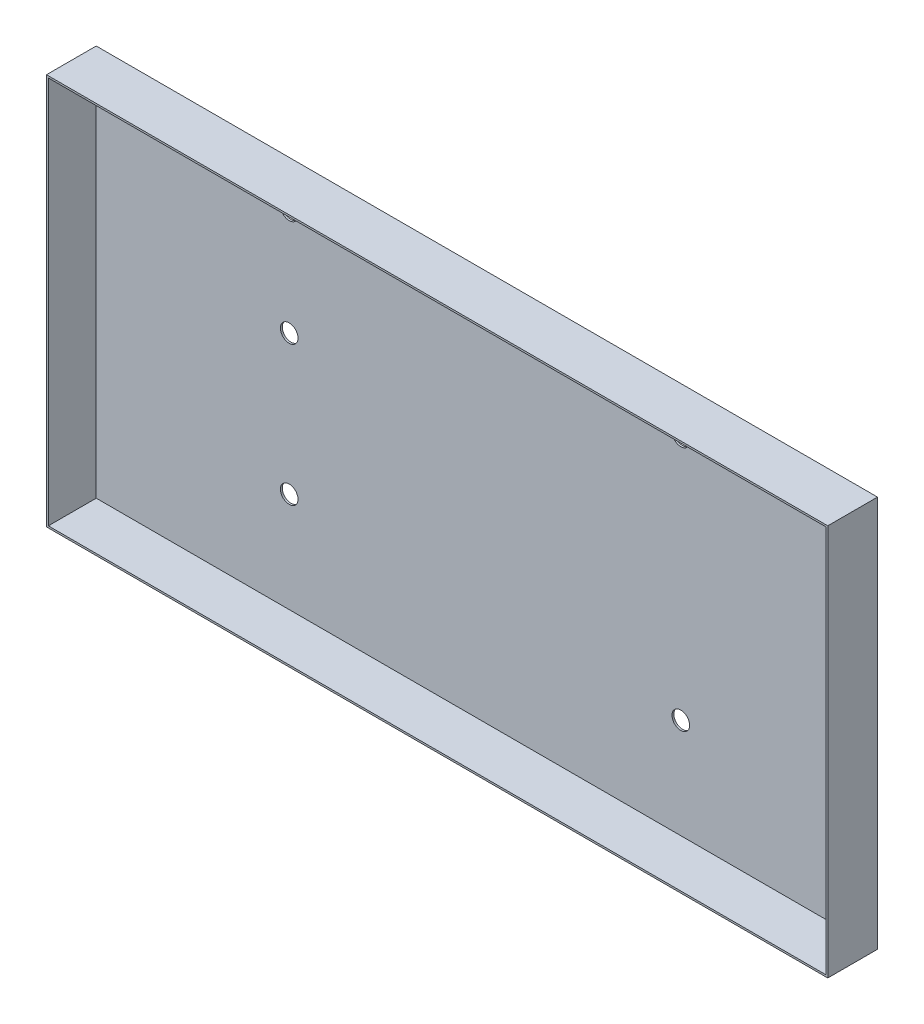
ISO-10303-21;
HEADER;
FILE_DESCRIPTION(('STEP AP214'),'2;1');
FILE_NAME('part.step','',(''),(''),'','','');
FILE_SCHEMA(('AUTOMOTIVE_DESIGN { 1 0 10303 214 1 1 1 1 }'));
ENDSEC;
DATA;
#1=APPLICATION_CONTEXT('core data for automotive mechanical design processes');
#2=APPLICATION_PROTOCOL_DEFINITION('international standard','automotive_design',2000,#1);
#3=PRODUCT_CONTEXT('',#1,'mechanical');
#4=PRODUCT('Part','Part','',(#3));
#5=PRODUCT_RELATED_PRODUCT_CATEGORY('part','',(#4));
#6=PRODUCT_DEFINITION_FORMATION('','',#4);
#7=PRODUCT_DEFINITION_CONTEXT('part definition',#1,'design');
#8=PRODUCT_DEFINITION('design','',#6,#7);
#9=PRODUCT_DEFINITION_SHAPE('','',#8);
#10=(LENGTH_UNIT() NAMED_UNIT(*) SI_UNIT(.MILLI.,.METRE.));
#11=(NAMED_UNIT(*) PLANE_ANGLE_UNIT() SI_UNIT($,.RADIAN.));
#12=(NAMED_UNIT(*) SI_UNIT($,.STERADIAN.) SOLID_ANGLE_UNIT());
#13=UNCERTAINTY_MEASURE_WITH_UNIT(LENGTH_MEASURE(1.E-05),#10,'distance_accuracy_value','');
#14=(GEOMETRIC_REPRESENTATION_CONTEXT(3) GLOBAL_UNCERTAINTY_ASSIGNED_CONTEXT((#13)) GLOBAL_UNIT_ASSIGNED_CONTEXT((#10,
#11,#12)) REPRESENTATION_CONTEXT('',''));
#15=CARTESIAN_POINT('',(0.,0.,0.));
#16=DIRECTION('',(0.,0.,1.));
#17=DIRECTION('',(1.,0.,0.));
#18=AXIS2_PLACEMENT_3D('',#15,#16,#17);
#19=CARTESIAN_POINT('',(-598.99999999997,355.,50.8));
#20=DIRECTION('',(0.,0.,-1.));
#21=DIRECTION('',(-1.,0.,0.));
#22=AXIS2_PLACEMENT_3D('',#19,#20,#21);
#23=CYLINDRICAL_SURFACE('',#22,9.00000000000004);
#24=CARTESIAN_POINT('',(-598.99999999997,355.,0.));
#25=DIRECTION('',(0.,0.,1.));
#26=DIRECTION('',(1.,0.,0.));
#27=AXIS2_PLACEMENT_3D('',#24,#25,#26);
#28=CIRCLE('',#27,9.00000000000004);
#29=CARTESIAN_POINT('',(-589.99999999997,355.,0.));
#30=VERTEX_POINT('',#29);
#31=EDGE_CURVE('E161',#30,#30,#28,.T.);
#32=ORIENTED_EDGE('',*,*,#31,.F.);
#33=EDGE_LOOP('',(#32));
#34=FACE_BOUND('',#33,.T.);
#35=CARTESIAN_POINT('',(-598.99999999997,355.,1.9));
#36=DIRECTION('',(0.,0.,1.));
#37=DIRECTION('',(1.,0.,0.));
#38=AXIS2_PLACEMENT_3D('',#35,#36,#37);
#39=CIRCLE('',#38,9.00000000000004);
#40=CARTESIAN_POINT('',(-589.99999999997,355.,1.9));
#41=VERTEX_POINT('',#40);
#42=EDGE_CURVE('E129',#41,#41,#39,.T.);
#43=ORIENTED_EDGE('',*,*,#42,.T.);
#44=EDGE_LOOP('',(#43));
#45=FACE_BOUND('',#44,.T.);
#46=ADVANCED_FACE('F32',(#34,#45),#23,.F.);
#47=CARTESIAN_POINT('',(-598.999999999968,246.5,50.8));
#48=DIRECTION('',(0.,0.,-1.));
#49=DIRECTION('',(-1.,0.,0.));
#50=AXIS2_PLACEMENT_3D('',#47,#48,#49);
#51=CYLINDRICAL_SURFACE('',#50,9.00000000000004);
#52=CARTESIAN_POINT('',(-598.999999999968,246.5,0.));
#53=DIRECTION('',(0.,0.,1.));
#54=DIRECTION('',(1.,0.,0.));
#55=AXIS2_PLACEMENT_3D('',#52,#53,#54);
#56=CIRCLE('',#55,9.00000000000004);
#57=CARTESIAN_POINT('',(-589.999999999968,246.5,0.));
#58=VERTEX_POINT('',#57);
#59=EDGE_CURVE('E158',#58,#58,#56,.T.);
#60=ORIENTED_EDGE('',*,*,#59,.F.);
#61=EDGE_LOOP('',(#60));
#62=FACE_BOUND('',#61,.T.);
#63=CARTESIAN_POINT('',(-598.999999999968,246.5,1.9));
#64=DIRECTION('',(0.,0.,1.));
#65=DIRECTION('',(1.,0.,0.));
#66=AXIS2_PLACEMENT_3D('',#63,#64,#65);
#67=CIRCLE('',#66,9.00000000000004);
#68=CARTESIAN_POINT('',(-589.999999999968,246.5,1.9));
#69=VERTEX_POINT('',#68);
#70=EDGE_CURVE('E133',#69,#69,#67,.T.);
#71=ORIENTED_EDGE('',*,*,#70,.T.);
#72=EDGE_LOOP('',(#71));
#73=FACE_BOUND('',#72,.T.);
#74=ADVANCED_FACE('F206',(#62,#73),#51,.F.);
#75=CARTESIAN_POINT('',(-598.999999999967,104.,50.8));
#76=DIRECTION('',(0.,0.,-1.));
#77=DIRECTION('',(-1.,0.,0.));
#78=AXIS2_PLACEMENT_3D('',#75,#76,#77);
#79=CYLINDRICAL_SURFACE('',#78,9.00000000000004);
#80=CARTESIAN_POINT('',(-598.999999999967,104.,0.));
#81=DIRECTION('',(0.,0.,1.));
#82=DIRECTION('',(1.,0.,0.));
#83=AXIS2_PLACEMENT_3D('',#80,#81,#82);
#84=CIRCLE('',#83,9.00000000000004);
#85=CARTESIAN_POINT('',(-589.999999999967,104.,0.));
#86=VERTEX_POINT('',#85);
#87=EDGE_CURVE('E155',#86,#86,#84,.T.);
#88=ORIENTED_EDGE('',*,*,#87,.F.);
#89=EDGE_LOOP('',(#88));
#90=FACE_BOUND('',#89,.T.);
#91=CARTESIAN_POINT('',(-598.999999999967,104.,1.9));
#92=DIRECTION('',(0.,0.,1.));
#93=DIRECTION('',(1.,0.,0.));
#94=AXIS2_PLACEMENT_3D('',#91,#92,#93);
#95=CIRCLE('',#94,9.00000000000004);
#96=CARTESIAN_POINT('',(-589.999999999967,104.,1.9));
#97=VERTEX_POINT('',#96);
#98=EDGE_CURVE('E341',#97,#97,#95,.T.);
#99=ORIENTED_EDGE('',*,*,#98,.T.);
#100=EDGE_LOOP('',(#99));
#101=FACE_BOUND('',#100,.T.);
#102=ADVANCED_FACE('F212',(#90,#101),#79,.F.);
#103=CARTESIAN_POINT('',(-198.999999999997,104.,50.8));
#104=DIRECTION('',(0.,0.,-1.));
#105=DIRECTION('',(-1.,0.,0.));
#106=AXIS2_PLACEMENT_3D('',#103,#104,#105);
#107=CYLINDRICAL_SURFACE('',#106,9.00000000000004);
#108=CARTESIAN_POINT('',(-198.999999999997,104.,0.));
#109=DIRECTION('',(0.,0.,1.));
#110=DIRECTION('',(1.,0.,0.));
#111=AXIS2_PLACEMENT_3D('',#108,#109,#110);
#112=CIRCLE('',#111,9.00000000000004);
#113=CARTESIAN_POINT('',(-189.999999999997,104.,0.));
#114=VERTEX_POINT('',#113);
#115=EDGE_CURVE('E152',#114,#114,#112,.T.);
#116=ORIENTED_EDGE('',*,*,#115,.F.);
#117=EDGE_LOOP('',(#116));
#118=FACE_BOUND('',#117,.T.);
#119=CARTESIAN_POINT('',(-198.999999999997,104.,1.9));
#120=DIRECTION('',(0.,0.,1.));
#121=DIRECTION('',(1.,0.,0.));
#122=AXIS2_PLACEMENT_3D('',#119,#120,#121);
#123=CIRCLE('',#122,9.00000000000004);
#124=CARTESIAN_POINT('',(-189.999999999997,104.,1.9));
#125=VERTEX_POINT('',#124);
#126=EDGE_CURVE('E338',#125,#125,#123,.T.);
#127=ORIENTED_EDGE('',*,*,#126,.T.);
#128=EDGE_LOOP('',(#127));
#129=FACE_BOUND('',#128,.T.);
#130=ADVANCED_FACE('F306',(#118,#129),#107,.F.);
#131=CARTESIAN_POINT('',(-199.,355.,50.8));
#132=DIRECTION('',(0.,0.,-1.));
#133=DIRECTION('',(-1.,0.,0.));
#134=AXIS2_PLACEMENT_3D('',#131,#132,#133);
#135=CYLINDRICAL_SURFACE('',#134,9.00000000000004);
#136=CARTESIAN_POINT('',(-199.,355.,0.));
#137=DIRECTION('',(0.,0.,1.));
#138=DIRECTION('',(1.,0.,0.));
#139=AXIS2_PLACEMENT_3D('',#136,#137,#138);
#140=CIRCLE('',#139,9.00000000000004);
#141=CARTESIAN_POINT('',(-190.,355.,0.));
#142=VERTEX_POINT('',#141);
#143=EDGE_CURVE('E138',#142,#142,#140,.T.);
#144=ORIENTED_EDGE('',*,*,#143,.F.);
#145=EDGE_LOOP('',(#144));
#146=FACE_BOUND('',#145,.T.);
#147=CARTESIAN_POINT('',(-199.,355.,1.9));
#148=DIRECTION('',(0.,0.,1.));
#149=DIRECTION('',(1.,0.,0.));
#150=AXIS2_PLACEMENT_3D('',#147,#148,#149);
#151=CIRCLE('',#150,9.00000000000004);
#152=CARTESIAN_POINT('',(-190.,355.,1.9));
#153=VERTEX_POINT('',#152);
#154=EDGE_CURVE('E337',#153,#153,#151,.T.);
#155=ORIENTED_EDGE('',*,*,#154,.T.);
#156=EDGE_LOOP('',(#155));
#157=FACE_BOUND('',#156,.T.);
#158=ADVANCED_FACE('F221',(#146,#157),#135,.F.);
#159=CARTESIAN_POINT('',(0.,0.,50.8));
#160=DIRECTION('',(0.,0.,1.));
#161=DIRECTION('',(1.,0.,0.));
#162=AXIS2_PLACEMENT_3D('',#159,#160,#161);
#163=PLANE('',#162);
#164=DIRECTION('',(-1.,0.,0.));
#165=VECTOR('',#164,1.);
#166=CARTESIAN_POINT('',(0.,398.1,50.8));
#167=LINE('',#166,#165);
#168=CARTESIAN_POINT('',(-1.9,398.1,50.8));
#169=VERTEX_POINT('',#168);
#170=CARTESIAN_POINT('',(-796.1,398.1,50.8));
#171=VERTEX_POINT('',#170);
#172=EDGE_CURVE('E114',#169,#171,#167,.T.);
#173=ORIENTED_EDGE('',*,*,#172,.F.);
#174=DIRECTION('',(0.,1.,0.));
#175=VECTOR('',#174,1.);
#176=CARTESIAN_POINT('',(-1.9,0.,50.8));
#177=LINE('',#176,#175);
#178=CARTESIAN_POINT('',(-1.9,1.9,50.8));
#179=VERTEX_POINT('',#178);
#180=EDGE_CURVE('E120',#179,#169,#177,.T.);
#181=ORIENTED_EDGE('',*,*,#180,.F.);
#182=DIRECTION('',(1.,0.,0.));
#183=VECTOR('',#182,1.);
#184=CARTESIAN_POINT('',(-798.,1.9,50.8));
#185=LINE('',#184,#183);
#186=CARTESIAN_POINT('',(-796.1,1.9,50.8));
#187=VERTEX_POINT('',#186);
#188=EDGE_CURVE('E147',#187,#179,#185,.T.);
#189=ORIENTED_EDGE('',*,*,#188,.F.);
#190=DIRECTION('',(0.,-1.,0.));
#191=VECTOR('',#190,1.);
#192=CARTESIAN_POINT('',(-796.1,400.,50.8));
#193=LINE('',#192,#191);
#194=EDGE_CURVE('E145',#171,#187,#193,.T.);
#195=ORIENTED_EDGE('',*,*,#194,.F.);
#196=EDGE_LOOP('',(#173,#181,#189,#195));
#197=FACE_BOUND('',#196,.T.);
#198=DIRECTION('',(-1.,0.,0.));
#199=VECTOR('',#198,1.);
#200=CARTESIAN_POINT('',(0.,400.,50.8));
#201=LINE('',#200,#199);
#202=CARTESIAN_POINT('',(0.,400.,50.8));
#203=VERTEX_POINT('',#202);
#204=CARTESIAN_POINT('',(-798.,400.,50.8));
#205=VERTEX_POINT('',#204);
#206=EDGE_CURVE('E165',#203,#205,#201,.T.);
#207=ORIENTED_EDGE('',*,*,#206,.T.);
#208=DIRECTION('',(0.,-1.,0.));
#209=VECTOR('',#208,1.);
#210=CARTESIAN_POINT('',(-798.,400.,50.8));
#211=LINE('',#210,#209);
#212=CARTESIAN_POINT('',(-798.,0.,50.8));
#213=VERTEX_POINT('',#212);
#214=EDGE_CURVE('E84',#205,#213,#211,.T.);
#215=ORIENTED_EDGE('',*,*,#214,.T.);
#216=DIRECTION('',(1.,0.,0.));
#217=VECTOR('',#216,1.);
#218=CARTESIAN_POINT('',(-798.,0.,50.8));
#219=LINE('',#218,#217);
#220=CARTESIAN_POINT('',(0.,0.,50.8));
#221=VERTEX_POINT('',#220);
#222=EDGE_CURVE('E168',#213,#221,#219,.T.);
#223=ORIENTED_EDGE('',*,*,#222,.T.);
#224=DIRECTION('',(0.,1.,0.));
#225=VECTOR('',#224,1.);
#226=CARTESIAN_POINT('',(0.,0.,50.8));
#227=LINE('',#226,#225);
#228=EDGE_CURVE('E56',#221,#203,#227,.T.);
#229=ORIENTED_EDGE('',*,*,#228,.T.);
#230=EDGE_LOOP('',(#207,#215,#223,#229));
#231=FACE_BOUND('',#230,.T.);
#232=ADVANCED_FACE('F219',(#197,#231),#163,.T.);
#233=CARTESIAN_POINT('',(0.,0.,0.));
#234=DIRECTION('',(0.,0.,1.));
#235=DIRECTION('',(1.,0.,0.));
#236=AXIS2_PLACEMENT_3D('',#233,#234,#235);
#237=PLANE('',#236);
#238=DIRECTION('',(-1.,0.,0.));
#239=VECTOR('',#238,1.);
#240=CARTESIAN_POINT('',(0.,400.,0.));
#241=LINE('',#240,#239);
#242=CARTESIAN_POINT('',(0.,400.,0.));
#243=VERTEX_POINT('',#242);
#244=CARTESIAN_POINT('',(-798.,400.,0.));
#245=VERTEX_POINT('',#244);
#246=EDGE_CURVE('E164',#243,#245,#241,.T.);
#247=ORIENTED_EDGE('',*,*,#246,.F.);
#248=DIRECTION('',(0.,1.,0.));
#249=VECTOR('',#248,1.);
#250=CARTESIAN_POINT('',(0.,0.,0.));
#251=LINE('',#250,#249);
#252=CARTESIAN_POINT('',(0.,0.,0.));
#253=VERTEX_POINT('',#252);
#254=EDGE_CURVE('E77',#253,#243,#251,.T.);
#255=ORIENTED_EDGE('',*,*,#254,.F.);
#256=DIRECTION('',(1.,0.,0.));
#257=VECTOR('',#256,1.);
#258=CARTESIAN_POINT('',(-798.,0.,0.));
#259=LINE('',#258,#257);
#260=CARTESIAN_POINT('',(-798.,0.,0.));
#261=VERTEX_POINT('',#260);
#262=EDGE_CURVE('E176',#261,#253,#259,.T.);
#263=ORIENTED_EDGE('',*,*,#262,.F.);
#264=DIRECTION('',(0.,-1.,0.));
#265=VECTOR('',#264,1.);
#266=CARTESIAN_POINT('',(-798.,400.,0.));
#267=LINE('',#266,#265);
#268=EDGE_CURVE('E174',#245,#261,#267,.T.);
#269=ORIENTED_EDGE('',*,*,#268,.F.);
#270=EDGE_LOOP('',(#247,#255,#263,#269));
#271=FACE_BOUND('',#270,.T.);
#272=ORIENTED_EDGE('',*,*,#31,.T.);
#273=EDGE_LOOP('',(#272));
#274=FACE_BOUND('',#273,.T.);
#275=ORIENTED_EDGE('',*,*,#59,.T.);
#276=EDGE_LOOP('',(#275));
#277=FACE_BOUND('',#276,.T.);
#278=ORIENTED_EDGE('',*,*,#87,.T.);
#279=EDGE_LOOP('',(#278));
#280=FACE_BOUND('',#279,.T.);
#281=ORIENTED_EDGE('',*,*,#115,.T.);
#282=EDGE_LOOP('',(#281));
#283=FACE_BOUND('',#282,.T.);
#284=ORIENTED_EDGE('',*,*,#143,.T.);
#285=EDGE_LOOP('',(#284));
#286=FACE_BOUND('',#285,.T.);
#287=ADVANCED_FACE('F189',(#271,#274,#277,#280,#283,#286),#237,.F.);
#288=CARTESIAN_POINT('',(0.,400.,50.8));
#289=DIRECTION('',(0.,-1.,0.));
#290=DIRECTION('',(1.,0.,0.));
#291=AXIS2_PLACEMENT_3D('',#288,#289,#290);
#292=PLANE('',#291);
#293=ORIENTED_EDGE('',*,*,#246,.T.);
#294=DIRECTION('',(0.,0.,-1.));
#295=VECTOR('',#294,1.);
#296=CARTESIAN_POINT('',(-798.,400.,50.8));
#297=LINE('',#296,#295);
#298=EDGE_CURVE('E11',#205,#245,#297,.T.);
#299=ORIENTED_EDGE('',*,*,#298,.F.);
#300=ORIENTED_EDGE('',*,*,#206,.F.);
#301=DIRECTION('',(0.,0.,-1.));
#302=VECTOR('',#301,1.);
#303=CARTESIAN_POINT('',(0.,400.,50.8));
#304=LINE('',#303,#302);
#305=EDGE_CURVE('E171',#203,#243,#304,.T.);
#306=ORIENTED_EDGE('',*,*,#305,.T.);
#307=EDGE_LOOP('',(#293,#299,#300,#306));
#308=FACE_BOUND('',#307,.T.);
#309=ADVANCED_FACE('F34',(#308),#292,.F.);
#310=CARTESIAN_POINT('',(-798.,400.,50.8));
#311=DIRECTION('',(1.,0.,0.));
#312=DIRECTION('',(0.,0.,-1.));
#313=AXIS2_PLACEMENT_3D('',#310,#311,#312);
#314=PLANE('',#313);
#315=ORIENTED_EDGE('',*,*,#268,.T.);
#316=DIRECTION('',(0.,0.,-1.));
#317=VECTOR('',#316,1.);
#318=CARTESIAN_POINT('',(-798.,0.,50.8));
#319=LINE('',#318,#317);
#320=EDGE_CURVE('E40',#213,#261,#319,.T.);
#321=ORIENTED_EDGE('',*,*,#320,.F.);
#322=ORIENTED_EDGE('',*,*,#214,.F.);
#323=ORIENTED_EDGE('',*,*,#298,.T.);
#324=EDGE_LOOP('',(#315,#321,#322,#323));
#325=FACE_BOUND('',#324,.T.);
#326=ADVANCED_FACE('F202',(#325),#314,.F.);
#327=CARTESIAN_POINT('',(-798.,0.,50.8));
#328=DIRECTION('',(0.,1.,0.));
#329=DIRECTION('',(0.,0.,1.));
#330=AXIS2_PLACEMENT_3D('',#327,#328,#329);
#331=PLANE('',#330);
#332=ORIENTED_EDGE('',*,*,#262,.T.);
#333=DIRECTION('',(0.,0.,-1.));
#334=VECTOR('',#333,1.);
#335=CARTESIAN_POINT('',(0.,0.,50.8));
#336=LINE('',#335,#334);
#337=EDGE_CURVE('E180',#221,#253,#336,.T.);
#338=ORIENTED_EDGE('',*,*,#337,.F.);
#339=ORIENTED_EDGE('',*,*,#222,.F.);
#340=ORIENTED_EDGE('',*,*,#320,.T.);
#341=EDGE_LOOP('',(#332,#338,#339,#340));
#342=FACE_BOUND('',#341,.T.);
#343=ADVANCED_FACE('F185',(#342),#331,.F.);
#344=CARTESIAN_POINT('',(0.,0.,50.8));
#345=DIRECTION('',(-1.,0.,0.));
#346=DIRECTION('',(0.,0.,1.));
#347=AXIS2_PLACEMENT_3D('',#344,#345,#346);
#348=PLANE('',#347);
#349=ORIENTED_EDGE('',*,*,#254,.T.);
#350=ORIENTED_EDGE('',*,*,#305,.F.);
#351=ORIENTED_EDGE('',*,*,#228,.F.);
#352=ORIENTED_EDGE('',*,*,#337,.T.);
#353=EDGE_LOOP('',(#349,#350,#351,#352));
#354=FACE_BOUND('',#353,.T.);
#355=ADVANCED_FACE('F194',(#354),#348,.F.);
#356=CARTESIAN_POINT('',(0.,0.,1.9));
#357=DIRECTION('',(0.,0.,1.));
#358=DIRECTION('',(1.,0.,0.));
#359=AXIS2_PLACEMENT_3D('',#356,#357,#358);
#360=PLANE('',#359);
#361=DIRECTION('',(-1.,0.,0.));
#362=VECTOR('',#361,1.);
#363=CARTESIAN_POINT('',(0.,398.1,1.9));
#364=LINE('',#363,#362);
#365=CARTESIAN_POINT('',(-1.9,398.1,1.9));
#366=VERTEX_POINT('',#365);
#367=CARTESIAN_POINT('',(-796.1,398.1,1.9));
#368=VERTEX_POINT('',#367);
#369=EDGE_CURVE('E111',#366,#368,#364,.T.);
#370=ORIENTED_EDGE('',*,*,#369,.T.);
#371=DIRECTION('',(0.,-1.,0.));
#372=VECTOR('',#371,1.);
#373=CARTESIAN_POINT('',(-796.1,400.,1.9));
#374=LINE('',#373,#372);
#375=CARTESIAN_POINT('',(-796.1,1.9,1.9));
#376=VERTEX_POINT('',#375);
#377=EDGE_CURVE('E128',#368,#376,#374,.T.);
#378=ORIENTED_EDGE('',*,*,#377,.T.);
#379=DIRECTION('',(1.,0.,0.));
#380=VECTOR('',#379,1.);
#381=CARTESIAN_POINT('',(-798.,1.9,1.9));
#382=LINE('',#381,#380);
#383=CARTESIAN_POINT('',(-1.9,1.9,1.9));
#384=VERTEX_POINT('',#383);
#385=EDGE_CURVE('E113',#376,#384,#382,.T.);
#386=ORIENTED_EDGE('',*,*,#385,.T.);
#387=DIRECTION('',(0.,1.,0.));
#388=VECTOR('',#387,1.);
#389=CARTESIAN_POINT('',(-1.9,0.,1.9));
#390=LINE('',#389,#388);
#391=EDGE_CURVE('E106',#384,#366,#390,.T.);
#392=ORIENTED_EDGE('',*,*,#391,.T.);
#393=EDGE_LOOP('',(#370,#378,#386,#392));
#394=FACE_BOUND('',#393,.T.);
#395=ORIENTED_EDGE('',*,*,#154,.F.);
#396=EDGE_LOOP('',(#395));
#397=FACE_BOUND('',#396,.T.);
#398=ORIENTED_EDGE('',*,*,#126,.F.);
#399=EDGE_LOOP('',(#398));
#400=FACE_BOUND('',#399,.T.);
#401=ORIENTED_EDGE('',*,*,#98,.F.);
#402=EDGE_LOOP('',(#401));
#403=FACE_BOUND('',#402,.T.);
#404=ORIENTED_EDGE('',*,*,#70,.F.);
#405=EDGE_LOOP('',(#404));
#406=FACE_BOUND('',#405,.T.);
#407=ORIENTED_EDGE('',*,*,#42,.F.);
#408=EDGE_LOOP('',(#407));
#409=FACE_BOUND('',#408,.T.);
#410=ADVANCED_FACE('F108',(#394,#397,#400,#403,#406,#409),#360,.T.);
#411=CARTESIAN_POINT('',(0.,398.1,50.8));
#412=DIRECTION('',(0.,-1.,0.));
#413=DIRECTION('',(1.,0.,0.));
#414=AXIS2_PLACEMENT_3D('',#411,#412,#413);
#415=PLANE('',#414);
#416=ORIENTED_EDGE('',*,*,#369,.F.);
#417=DIRECTION('',(0.,0.,-1.));
#418=VECTOR('',#417,1.);
#419=CARTESIAN_POINT('',(-1.9,398.1,50.8));
#420=LINE('',#419,#418);
#421=EDGE_CURVE('E117',#169,#366,#420,.T.);
#422=ORIENTED_EDGE('',*,*,#421,.F.);
#423=ORIENTED_EDGE('',*,*,#172,.T.);
#424=DIRECTION('',(0.,0.,-1.));
#425=VECTOR('',#424,1.);
#426=CARTESIAN_POINT('',(-796.1,398.1,50.8));
#427=LINE('',#426,#425);
#428=EDGE_CURVE('E127',#171,#368,#427,.T.);
#429=ORIENTED_EDGE('',*,*,#428,.T.);
#430=EDGE_LOOP('',(#416,#422,#423,#429));
#431=FACE_BOUND('',#430,.T.);
#432=ADVANCED_FACE('F125',(#431),#415,.T.);
#433=CARTESIAN_POINT('',(-796.1,400.,50.8));
#434=DIRECTION('',(1.,0.,0.));
#435=DIRECTION('',(0.,0.,-1.));
#436=AXIS2_PLACEMENT_3D('',#433,#434,#435);
#437=PLANE('',#436);
#438=ORIENTED_EDGE('',*,*,#377,.F.);
#439=ORIENTED_EDGE('',*,*,#428,.F.);
#440=ORIENTED_EDGE('',*,*,#194,.T.);
#441=DIRECTION('',(0.,0.,-1.));
#442=VECTOR('',#441,1.);
#443=CARTESIAN_POINT('',(-796.1,1.9,50.8));
#444=LINE('',#443,#442);
#445=EDGE_CURVE('E139',#187,#376,#444,.T.);
#446=ORIENTED_EDGE('',*,*,#445,.T.);
#447=EDGE_LOOP('',(#438,#439,#440,#446));
#448=FACE_BOUND('',#447,.T.);
#449=ADVANCED_FACE('F258',(#448),#437,.T.);
#450=CARTESIAN_POINT('',(-798.,1.9,50.8));
#451=DIRECTION('',(0.,1.,0.));
#452=DIRECTION('',(0.,0.,1.));
#453=AXIS2_PLACEMENT_3D('',#450,#451,#452);
#454=PLANE('',#453);
#455=ORIENTED_EDGE('',*,*,#385,.F.);
#456=ORIENTED_EDGE('',*,*,#445,.F.);
#457=ORIENTED_EDGE('',*,*,#188,.T.);
#458=DIRECTION('',(0.,0.,-1.));
#459=VECTOR('',#458,1.);
#460=CARTESIAN_POINT('',(-1.9,1.9,50.8));
#461=LINE('',#460,#459);
#462=EDGE_CURVE('E47',#179,#384,#461,.T.);
#463=ORIENTED_EDGE('',*,*,#462,.T.);
#464=EDGE_LOOP('',(#455,#456,#457,#463));
#465=FACE_BOUND('',#464,.T.);
#466=ADVANCED_FACE('F267',(#465),#454,.T.);
#467=CARTESIAN_POINT('',(-1.9,0.,50.8));
#468=DIRECTION('',(-1.,0.,0.));
#469=DIRECTION('',(0.,0.,1.));
#470=AXIS2_PLACEMENT_3D('',#467,#468,#469);
#471=PLANE('',#470);
#472=ORIENTED_EDGE('',*,*,#391,.F.);
#473=ORIENTED_EDGE('',*,*,#462,.F.);
#474=ORIENTED_EDGE('',*,*,#180,.T.);
#475=ORIENTED_EDGE('',*,*,#421,.T.);
#476=EDGE_LOOP('',(#472,#473,#474,#475));
#477=FACE_BOUND('',#476,.T.);
#478=ADVANCED_FACE('F118',(#477),#471,.T.);
#479=CLOSED_SHELL('',(#46,#74,#102,#130,#158,#232,#287,#309,#326,#343,#355,#410,#432,#449,#466,#478));
#480=MANIFOLD_SOLID_BREP('B2',#479);
#481=ADVANCED_BREP_SHAPE_REPRESENTATION('',(#18,#480),#14);
#482=SHAPE_DEFINITION_REPRESENTATION(#9,#481);
ENDSEC;
END-ISO-10303-21;
